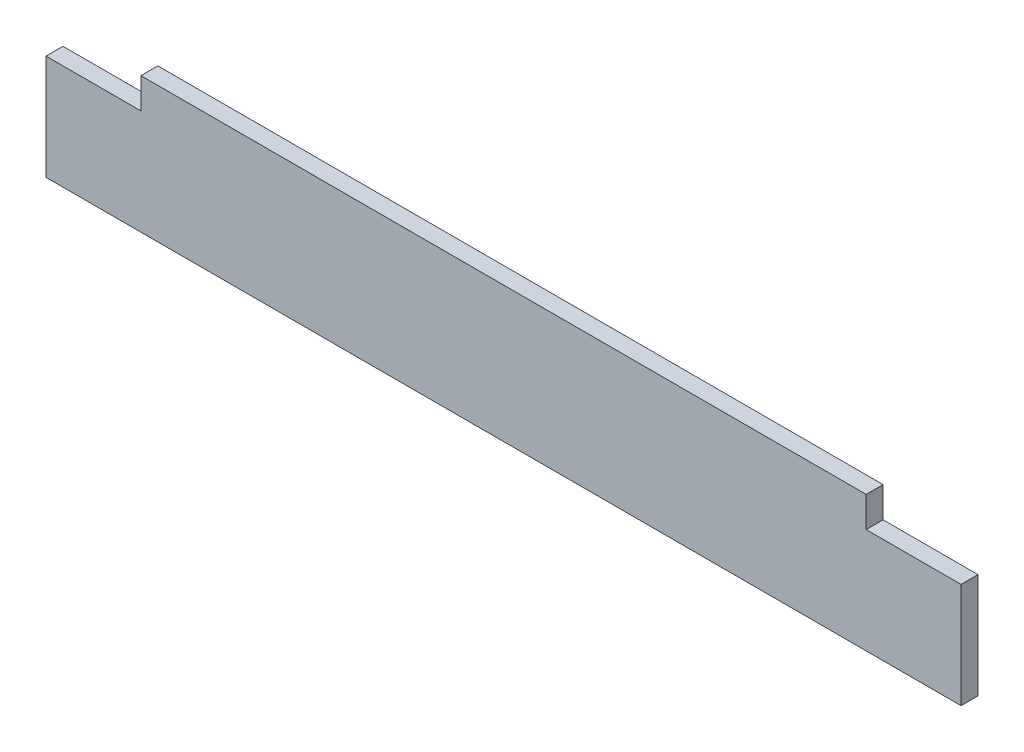
ISO-10303-21;
HEADER;
FILE_DESCRIPTION(('STEP AP214'),'2;1');
FILE_NAME('part.step','',(''),(''),'','','');
FILE_SCHEMA(('AUTOMOTIVE_DESIGN { 1 0 10303 214 1 1 1 1 }'));
ENDSEC;
DATA;
#1=APPLICATION_CONTEXT('core data for automotive mechanical design processes');
#2=APPLICATION_PROTOCOL_DEFINITION('international standard','automotive_design',2000,#1);
#3=PRODUCT_CONTEXT('',#1,'mechanical');
#4=PRODUCT('Part','Part','',(#3));
#5=PRODUCT_RELATED_PRODUCT_CATEGORY('part','',(#4));
#6=PRODUCT_DEFINITION_FORMATION('','',#4);
#7=PRODUCT_DEFINITION_CONTEXT('part definition',#1,'design');
#8=PRODUCT_DEFINITION('design','',#6,#7);
#9=PRODUCT_DEFINITION_SHAPE('','',#8);
#10=(LENGTH_UNIT() NAMED_UNIT(*) SI_UNIT(.MILLI.,.METRE.));
#11=(NAMED_UNIT(*) PLANE_ANGLE_UNIT() SI_UNIT($,.RADIAN.));
#12=(NAMED_UNIT(*) SI_UNIT($,.STERADIAN.) SOLID_ANGLE_UNIT());
#13=UNCERTAINTY_MEASURE_WITH_UNIT(LENGTH_MEASURE(1.E-05),#10,'distance_accuracy_value','');
#14=(GEOMETRIC_REPRESENTATION_CONTEXT(3) GLOBAL_UNCERTAINTY_ASSIGNED_CONTEXT((#13)) GLOBAL_UNIT_ASSIGNED_CONTEXT((#10,
#11,#12)) REPRESENTATION_CONTEXT('',''));
#15=CARTESIAN_POINT('',(0.,0.,0.));
#16=DIRECTION('',(0.,0.,1.));
#17=DIRECTION('',(1.,0.,0.));
#18=AXIS2_PLACEMENT_3D('',#15,#16,#17);
#19=CARTESIAN_POINT('',(-135.,20.,5.));
#20=DIRECTION('',(1.,0.,0.));
#21=DIRECTION('',(0.,0.,-1.));
#22=AXIS2_PLACEMENT_3D('',#19,#20,#21);
#23=PLANE('',#22);
#24=DIRECTION('',(0.,0.,1.));
#25=VECTOR('',#24,1.);
#26=CARTESIAN_POINT('',(-135.,11.,0.));
#27=LINE('',#26,#25);
#28=CARTESIAN_POINT('',(-135.,11.,0.));
#29=VERTEX_POINT('',#28);
#30=CARTESIAN_POINT('',(-135.,11.,5.));
#31=VERTEX_POINT('',#30);
#32=EDGE_CURVE('E96',#29,#31,#27,.T.);
#33=ORIENTED_EDGE('',*,*,#32,.F.);
#34=DIRECTION('',(0.,-1.,0.));
#35=VECTOR('',#34,1.);
#36=CARTESIAN_POINT('',(-135.,20.,0.));
#37=LINE('',#36,#35);
#38=CARTESIAN_POINT('',(-135.,-20.,0.));
#39=VERTEX_POINT('',#38);
#40=EDGE_CURVE('E131',#29,#39,#37,.T.);
#41=ORIENTED_EDGE('',*,*,#40,.T.);
#42=DIRECTION('',(0.,0.,-1.));
#43=VECTOR('',#42,1.);
#44=CARTESIAN_POINT('',(-135.,-20.,5.));
#45=LINE('',#44,#43);
#46=CARTESIAN_POINT('',(-135.,-20.,5.));
#47=VERTEX_POINT('',#46);
#48=EDGE_CURVE('E11',#47,#39,#45,.T.);
#49=ORIENTED_EDGE('',*,*,#48,.F.);
#50=DIRECTION('',(0.,-1.,0.));
#51=VECTOR('',#50,1.);
#52=CARTESIAN_POINT('',(-135.,20.,5.));
#53=LINE('',#52,#51);
#54=EDGE_CURVE('E110',#31,#47,#53,.T.);
#55=ORIENTED_EDGE('',*,*,#54,.F.);
#56=EDGE_LOOP('',(#33,#41,#49,#55));
#57=FACE_BOUND('',#56,.T.);
#58=ADVANCED_FACE('F32',(#57),#23,.F.);
#59=CARTESIAN_POINT('',(135.,20.,5.));
#60=DIRECTION('',(-1.,0.,0.));
#61=DIRECTION('',(0.,0.,1.));
#62=AXIS2_PLACEMENT_3D('',#59,#60,#61);
#63=PLANE('',#62);
#64=DIRECTION('',(0.,1.,0.));
#65=VECTOR('',#64,1.);
#66=CARTESIAN_POINT('',(135.,20.,0.));
#67=LINE('',#66,#65);
#68=CARTESIAN_POINT('',(135.,-20.,0.));
#69=VERTEX_POINT('',#68);
#70=CARTESIAN_POINT('',(135.,11.,0.));
#71=VERTEX_POINT('',#70);
#72=EDGE_CURVE('E124',#69,#71,#67,.T.);
#73=ORIENTED_EDGE('',*,*,#72,.T.);
#74=DIRECTION('',(0.,0.,-1.));
#75=VECTOR('',#74,1.);
#76=CARTESIAN_POINT('',(135.,11.,0.));
#77=LINE('',#76,#75);
#78=CARTESIAN_POINT('',(135.,11.,5.));
#79=VERTEX_POINT('',#78);
#80=EDGE_CURVE('E55',#79,#71,#77,.T.);
#81=ORIENTED_EDGE('',*,*,#80,.F.);
#82=DIRECTION('',(0.,1.,0.));
#83=VECTOR('',#82,1.);
#84=CARTESIAN_POINT('',(135.,20.,5.));
#85=LINE('',#84,#83);
#86=CARTESIAN_POINT('',(135.,-20.,5.));
#87=VERTEX_POINT('',#86);
#88=EDGE_CURVE('E120',#87,#79,#85,.T.);
#89=ORIENTED_EDGE('',*,*,#88,.F.);
#90=DIRECTION('',(0.,0.,-1.));
#91=VECTOR('',#90,1.);
#92=CARTESIAN_POINT('',(135.,-20.,5.));
#93=LINE('',#92,#91);
#94=EDGE_CURVE('E40',#87,#69,#93,.T.);
#95=ORIENTED_EDGE('',*,*,#94,.T.);
#96=EDGE_LOOP('',(#73,#81,#89,#95));
#97=FACE_BOUND('',#96,.T.);
#98=ADVANCED_FACE('F34',(#97),#63,.F.);
#99=CARTESIAN_POINT('',(-135.,20.,5.));
#100=DIRECTION('',(0.,-1.,0.));
#101=DIRECTION('',(0.,0.,-1.));
#102=AXIS2_PLACEMENT_3D('',#99,#100,#101);
#103=PLANE('',#102);
#104=DIRECTION('',(-1.,0.,0.));
#105=VECTOR('',#104,1.);
#106=CARTESIAN_POINT('',(-135.,20.,0.));
#107=LINE('',#106,#105);
#108=CARTESIAN_POINT('',(107.,20.,0.));
#109=VERTEX_POINT('',#108);
#110=CARTESIAN_POINT('',(-107.,20.,0.));
#111=VERTEX_POINT('',#110);
#112=EDGE_CURVE('E127',#109,#111,#107,.T.);
#113=ORIENTED_EDGE('',*,*,#112,.T.);
#114=DIRECTION('',(0.,0.,-1.));
#115=VECTOR('',#114,1.);
#116=CARTESIAN_POINT('',(-107.,20.,0.));
#117=LINE('',#116,#115);
#118=CARTESIAN_POINT('',(-107.,20.,5.));
#119=VERTEX_POINT('',#118);
#120=EDGE_CURVE('E106',#119,#111,#117,.T.);
#121=ORIENTED_EDGE('',*,*,#120,.F.);
#122=DIRECTION('',(-1.,0.,0.));
#123=VECTOR('',#122,1.);
#124=CARTESIAN_POINT('',(-135.,20.,5.));
#125=LINE('',#124,#123);
#126=CARTESIAN_POINT('',(107.,20.,5.));
#127=VERTEX_POINT('',#126);
#128=EDGE_CURVE('E117',#127,#119,#125,.T.);
#129=ORIENTED_EDGE('',*,*,#128,.F.);
#130=DIRECTION('',(0.,0.,1.));
#131=VECTOR('',#130,1.);
#132=CARTESIAN_POINT('',(107.,20.,0.));
#133=LINE('',#132,#131);
#134=EDGE_CURVE('E153',#109,#127,#133,.T.);
#135=ORIENTED_EDGE('',*,*,#134,.F.);
#136=EDGE_LOOP('',(#113,#121,#129,#135));
#137=FACE_BOUND('',#136,.T.);
#138=ADVANCED_FACE('F165',(#137),#103,.F.);
#139=CARTESIAN_POINT('',(-135.,-20.,5.));
#140=DIRECTION('',(0.,1.,0.));
#141=DIRECTION('',(0.,0.,1.));
#142=AXIS2_PLACEMENT_3D('',#139,#140,#141);
#143=PLANE('',#142);
#144=DIRECTION('',(1.,0.,0.));
#145=VECTOR('',#144,1.);
#146=CARTESIAN_POINT('',(-135.,-20.,0.));
#147=LINE('',#146,#145);
#148=EDGE_CURVE('E133',#39,#69,#147,.T.);
#149=ORIENTED_EDGE('',*,*,#148,.T.);
#150=ORIENTED_EDGE('',*,*,#94,.F.);
#151=DIRECTION('',(1.,0.,0.));
#152=VECTOR('',#151,1.);
#153=CARTESIAN_POINT('',(-135.,-20.,5.));
#154=LINE('',#153,#152);
#155=EDGE_CURVE('E116',#47,#87,#154,.T.);
#156=ORIENTED_EDGE('',*,*,#155,.F.);
#157=ORIENTED_EDGE('',*,*,#48,.T.);
#158=EDGE_LOOP('',(#149,#150,#156,#157));
#159=FACE_BOUND('',#158,.T.);
#160=ADVANCED_FACE('F163',(#159),#143,.F.);
#161=CARTESIAN_POINT('',(0.,0.,5.));
#162=DIRECTION('',(0.,0.,1.));
#163=DIRECTION('',(1.,0.,0.));
#164=AXIS2_PLACEMENT_3D('',#161,#162,#163);
#165=PLANE('',#164);
#166=DIRECTION('',(0.,1.,0.));
#167=VECTOR('',#166,1.);
#168=CARTESIAN_POINT('',(-107.,11.,5.));
#169=LINE('',#168,#167);
#170=CARTESIAN_POINT('',(-107.,11.,5.));
#171=VERTEX_POINT('',#170);
#172=EDGE_CURVE('E113',#171,#119,#169,.T.);
#173=ORIENTED_EDGE('',*,*,#172,.F.);
#174=DIRECTION('',(1.,0.,0.));
#175=VECTOR('',#174,1.);
#176=CARTESIAN_POINT('',(-135.,11.,5.));
#177=LINE('',#176,#175);
#178=EDGE_CURVE('E99',#31,#171,#177,.T.);
#179=ORIENTED_EDGE('',*,*,#178,.F.);
#180=ORIENTED_EDGE('',*,*,#54,.T.);
#181=ORIENTED_EDGE('',*,*,#155,.T.);
#182=ORIENTED_EDGE('',*,*,#88,.T.);
#183=DIRECTION('',(1.,0.,0.));
#184=VECTOR('',#183,1.);
#185=CARTESIAN_POINT('',(135.,11.,5.));
#186=LINE('',#185,#184);
#187=CARTESIAN_POINT('',(107.,11.,5.));
#188=VERTEX_POINT('',#187);
#189=EDGE_CURVE('E151',#188,#79,#186,.T.);
#190=ORIENTED_EDGE('',*,*,#189,.F.);
#191=DIRECTION('',(0.,1.,0.));
#192=VECTOR('',#191,1.);
#193=CARTESIAN_POINT('',(107.,11.,5.));
#194=LINE('',#193,#192);
#195=EDGE_CURVE('E128',#188,#127,#194,.T.);
#196=ORIENTED_EDGE('',*,*,#195,.T.);
#197=ORIENTED_EDGE('',*,*,#128,.T.);
#198=EDGE_LOOP('',(#173,#179,#180,#181,#182,#190,#196,#197));
#199=FACE_BOUND('',#198,.T.);
#200=ADVANCED_FACE('F109',(#199),#165,.T.);
#201=CARTESIAN_POINT('',(0.,0.,0.));
#202=DIRECTION('',(0.,0.,1.));
#203=DIRECTION('',(1.,0.,0.));
#204=AXIS2_PLACEMENT_3D('',#201,#202,#203);
#205=PLANE('',#204);
#206=DIRECTION('',(-1.,0.,0.));
#207=VECTOR('',#206,1.);
#208=CARTESIAN_POINT('',(-135.,11.,0.));
#209=LINE('',#208,#207);
#210=CARTESIAN_POINT('',(-107.,11.,0.));
#211=VERTEX_POINT('',#210);
#212=EDGE_CURVE('E102',#211,#29,#209,.T.);
#213=ORIENTED_EDGE('',*,*,#212,.F.);
#214=DIRECTION('',(0.,1.,0.));
#215=VECTOR('',#214,1.);
#216=CARTESIAN_POINT('',(-107.,11.,0.));
#217=LINE('',#216,#215);
#218=EDGE_CURVE('E159',#211,#111,#217,.T.);
#219=ORIENTED_EDGE('',*,*,#218,.T.);
#220=ORIENTED_EDGE('',*,*,#112,.F.);
#221=DIRECTION('',(0.,1.,0.));
#222=VECTOR('',#221,1.);
#223=CARTESIAN_POINT('',(107.,11.,0.));
#224=LINE('',#223,#222);
#225=CARTESIAN_POINT('',(107.,11.,0.));
#226=VERTEX_POINT('',#225);
#227=EDGE_CURVE('E147',#226,#109,#224,.T.);
#228=ORIENTED_EDGE('',*,*,#227,.F.);
#229=DIRECTION('',(-1.,0.,0.));
#230=VECTOR('',#229,1.);
#231=CARTESIAN_POINT('',(135.,11.,0.));
#232=LINE('',#231,#230);
#233=EDGE_CURVE('E145',#71,#226,#232,.T.);
#234=ORIENTED_EDGE('',*,*,#233,.F.);
#235=ORIENTED_EDGE('',*,*,#72,.F.);
#236=ORIENTED_EDGE('',*,*,#148,.F.);
#237=ORIENTED_EDGE('',*,*,#40,.F.);
#238=EDGE_LOOP('',(#213,#219,#220,#228,#234,#235,#236,#237));
#239=FACE_BOUND('',#238,.T.);
#240=ADVANCED_FACE('F143',(#239),#205,.F.);
#241=CARTESIAN_POINT('',(107.,11.,0.));
#242=DIRECTION('',(-1.,0.,0.));
#243=DIRECTION('',(0.,0.,1.));
#244=AXIS2_PLACEMENT_3D('',#241,#242,#243);
#245=PLANE('',#244);
#246=ORIENTED_EDGE('',*,*,#134,.T.);
#247=ORIENTED_EDGE('',*,*,#195,.F.);
#248=DIRECTION('',(0.,0.,1.));
#249=VECTOR('',#248,1.);
#250=CARTESIAN_POINT('',(107.,11.,0.));
#251=LINE('',#250,#249);
#252=EDGE_CURVE('E149',#226,#188,#251,.T.);
#253=ORIENTED_EDGE('',*,*,#252,.F.);
#254=ORIENTED_EDGE('',*,*,#227,.T.);
#255=EDGE_LOOP('',(#246,#247,#253,#254));
#256=FACE_BOUND('',#255,.T.);
#257=ADVANCED_FACE('F201',(#256),#245,.F.);
#258=CARTESIAN_POINT('',(0.,11.,0.));
#259=DIRECTION('',(0.,-1.,0.));
#260=DIRECTION('',(0.,0.,-1.));
#261=AXIS2_PLACEMENT_3D('',#258,#259,#260);
#262=PLANE('',#261);
#263=ORIENTED_EDGE('',*,*,#80,.T.);
#264=ORIENTED_EDGE('',*,*,#233,.T.);
#265=ORIENTED_EDGE('',*,*,#252,.T.);
#266=ORIENTED_EDGE('',*,*,#189,.T.);
#267=EDGE_LOOP('',(#263,#264,#265,#266));
#268=FACE_BOUND('',#267,.T.);
#269=ADVANCED_FACE('F210',(#268),#262,.F.);
#270=CARTESIAN_POINT('',(-107.,11.,0.));
#271=DIRECTION('',(1.,0.,0.));
#272=DIRECTION('',(0.,0.,-1.));
#273=AXIS2_PLACEMENT_3D('',#270,#271,#272);
#274=PLANE('',#273);
#275=ORIENTED_EDGE('',*,*,#120,.T.);
#276=ORIENTED_EDGE('',*,*,#218,.F.);
#277=DIRECTION('',(0.,0.,-1.));
#278=VECTOR('',#277,1.);
#279=CARTESIAN_POINT('',(-107.,11.,0.));
#280=LINE('',#279,#278);
#281=EDGE_CURVE('E47',#171,#211,#280,.T.);
#282=ORIENTED_EDGE('',*,*,#281,.F.);
#283=ORIENTED_EDGE('',*,*,#172,.T.);
#284=EDGE_LOOP('',(#275,#276,#282,#283));
#285=FACE_BOUND('',#284,.T.);
#286=ADVANCED_FACE('F220',(#285),#274,.F.);
#287=CARTESIAN_POINT('',(0.,11.,0.));
#288=DIRECTION('',(0.,1.,0.));
#289=DIRECTION('',(0.,0.,1.));
#290=AXIS2_PLACEMENT_3D('',#287,#288,#289);
#291=PLANE('',#290);
#292=ORIENTED_EDGE('',*,*,#32,.T.);
#293=ORIENTED_EDGE('',*,*,#178,.T.);
#294=ORIENTED_EDGE('',*,*,#281,.T.);
#295=ORIENTED_EDGE('',*,*,#212,.T.);
#296=EDGE_LOOP('',(#292,#293,#294,#295));
#297=FACE_BOUND('',#296,.T.);
#298=ADVANCED_FACE('F98',(#297),#291,.T.);
#299=CLOSED_SHELL('',(#58,#98,#138,#160,#200,#240,#257,#269,#286,#298));
#300=MANIFOLD_SOLID_BREP('B2',#299);
#301=ADVANCED_BREP_SHAPE_REPRESENTATION('',(#18,#300),#14);
#302=SHAPE_DEFINITION_REPRESENTATION(#9,#301);
ENDSEC;
END-ISO-10303-21;
